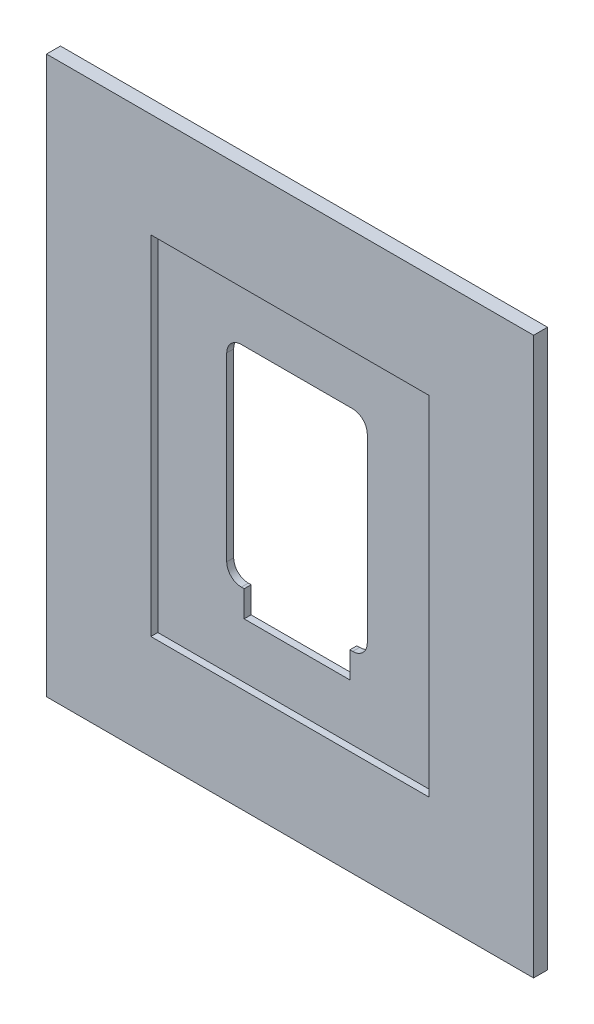
ISO-10303-21;
HEADER;
FILE_DESCRIPTION(('STEP AP214'),'2;1');
FILE_NAME('part.step','',(''),(''),'','','');
FILE_SCHEMA(('AUTOMOTIVE_DESIGN { 1 0 10303 214 1 1 1 1 }'));
ENDSEC;
DATA;
#1=APPLICATION_CONTEXT('core data for automotive mechanical design processes');
#2=APPLICATION_PROTOCOL_DEFINITION('international standard','automotive_design',2000,#1);
#3=PRODUCT_CONTEXT('',#1,'mechanical');
#4=PRODUCT('Part','Part','',(#3));
#5=PRODUCT_RELATED_PRODUCT_CATEGORY('part','',(#4));
#6=PRODUCT_DEFINITION_FORMATION('','',#4);
#7=PRODUCT_DEFINITION_CONTEXT('part definition',#1,'design');
#8=PRODUCT_DEFINITION('design','',#6,#7);
#9=PRODUCT_DEFINITION_SHAPE('','',#8);
#10=(LENGTH_UNIT() NAMED_UNIT(*) SI_UNIT(.MILLI.,.METRE.));
#11=(NAMED_UNIT(*) PLANE_ANGLE_UNIT() SI_UNIT($,.RADIAN.));
#12=(NAMED_UNIT(*) SI_UNIT($,.STERADIAN.) SOLID_ANGLE_UNIT());
#13=UNCERTAINTY_MEASURE_WITH_UNIT(LENGTH_MEASURE(1.E-05),#10,'distance_accuracy_value','');
#14=(GEOMETRIC_REPRESENTATION_CONTEXT(3) GLOBAL_UNCERTAINTY_ASSIGNED_CONTEXT((#13)) GLOBAL_UNIT_ASSIGNED_CONTEXT((#10,
#11,#12)) REPRESENTATION_CONTEXT('',''));
#15=CARTESIAN_POINT('',(0.,0.,0.));
#16=DIRECTION('',(0.,0.,1.));
#17=DIRECTION('',(1.,0.,0.));
#18=AXIS2_PLACEMENT_3D('',#15,#16,#17);
#19=CARTESIAN_POINT('',(70.,80.,2.));
#20=DIRECTION('',(-1.,0.,0.));
#21=DIRECTION('',(0.,-1.,0.));
#22=AXIS2_PLACEMENT_3D('',#19,#20,#21);
#23=PLANE('',#22);
#24=DIRECTION('',(0.,1.,0.));
#25=VECTOR('',#24,1.);
#26=CARTESIAN_POINT('',(70.,80.,0.));
#27=LINE('',#26,#25);
#28=CARTESIAN_POINT('',(70.,-80.,0.));
#29=VERTEX_POINT('',#28);
#30=CARTESIAN_POINT('',(70.,80.,0.));
#31=VERTEX_POINT('',#30);
#32=EDGE_CURVE('E305',#29,#31,#27,.T.);
#33=ORIENTED_EDGE('',*,*,#32,.T.);
#34=DIRECTION('',(0.,0.,-1.));
#35=VECTOR('',#34,1.);
#36=CARTESIAN_POINT('',(70.,80.,2.));
#37=LINE('',#36,#35);
#38=CARTESIAN_POINT('',(70.,80.,4.));
#39=VERTEX_POINT('',#38);
#40=EDGE_CURVE('E11',#39,#31,#37,.T.);
#41=ORIENTED_EDGE('',*,*,#40,.F.);
#42=DIRECTION('',(0.,1.,0.));
#43=VECTOR('',#42,1.);
#44=CARTESIAN_POINT('',(70.,-80.,4.));
#45=LINE('',#44,#43);
#46=CARTESIAN_POINT('',(70.,-80.,4.));
#47=VERTEX_POINT('',#46);
#48=EDGE_CURVE('E296',#47,#39,#45,.T.);
#49=ORIENTED_EDGE('',*,*,#48,.F.);
#50=DIRECTION('',(0.,0.,-1.));
#51=VECTOR('',#50,1.);
#52=CARTESIAN_POINT('',(70.,-80.,2.));
#53=LINE('',#52,#51);
#54=EDGE_CURVE('E314',#47,#29,#53,.T.);
#55=ORIENTED_EDGE('',*,*,#54,.T.);
#56=EDGE_LOOP('',(#33,#41,#49,#55));
#57=FACE_BOUND('',#56,.T.);
#58=ADVANCED_FACE('F33',(#57),#23,.F.);
#59=CARTESIAN_POINT('',(-70.,80.,2.));
#60=DIRECTION('',(0.,-1.,0.));
#61=DIRECTION('',(0.,0.,-1.));
#62=AXIS2_PLACEMENT_3D('',#59,#60,#61);
#63=PLANE('',#62);
#64=DIRECTION('',(-1.,0.,0.));
#65=VECTOR('',#64,1.);
#66=CARTESIAN_POINT('',(-70.,80.,0.));
#67=LINE('',#66,#65);
#68=CARTESIAN_POINT('',(-70.,80.,0.));
#69=VERTEX_POINT('',#68);
#70=EDGE_CURVE('E308',#31,#69,#67,.T.);
#71=ORIENTED_EDGE('',*,*,#70,.T.);
#72=DIRECTION('',(0.,0.,-1.));
#73=VECTOR('',#72,1.);
#74=CARTESIAN_POINT('',(-70.,80.,2.));
#75=LINE('',#74,#73);
#76=CARTESIAN_POINT('',(-70.,80.,4.));
#77=VERTEX_POINT('',#76);
#78=EDGE_CURVE('E40',#77,#69,#75,.T.);
#79=ORIENTED_EDGE('',*,*,#78,.F.);
#80=DIRECTION('',(-1.,0.,0.));
#81=VECTOR('',#80,1.);
#82=CARTESIAN_POINT('',(70.,80.,4.));
#83=LINE('',#82,#81);
#84=EDGE_CURVE('E299',#39,#77,#83,.T.);
#85=ORIENTED_EDGE('',*,*,#84,.F.);
#86=ORIENTED_EDGE('',*,*,#40,.T.);
#87=EDGE_LOOP('',(#71,#79,#85,#86));
#88=FACE_BOUND('',#87,.T.);
#89=ADVANCED_FACE('F336',(#88),#63,.F.);
#90=CARTESIAN_POINT('',(-70.,80.,2.));
#91=DIRECTION('',(1.,0.,0.));
#92=DIRECTION('',(0.,1.,0.));
#93=AXIS2_PLACEMENT_3D('',#90,#91,#92);
#94=PLANE('',#93);
#95=DIRECTION('',(0.,-1.,0.));
#96=VECTOR('',#95,1.);
#97=CARTESIAN_POINT('',(-70.,80.,0.));
#98=LINE('',#97,#96);
#99=CARTESIAN_POINT('',(-70.,-80.,0.));
#100=VERTEX_POINT('',#99);
#101=EDGE_CURVE('E310',#69,#100,#98,.T.);
#102=ORIENTED_EDGE('',*,*,#101,.T.);
#103=DIRECTION('',(0.,0.,-1.));
#104=VECTOR('',#103,1.);
#105=CARTESIAN_POINT('',(-70.,-80.,2.));
#106=LINE('',#105,#104);
#107=CARTESIAN_POINT('',(-70.,-80.,4.));
#108=VERTEX_POINT('',#107);
#109=EDGE_CURVE('E317',#108,#100,#106,.T.);
#110=ORIENTED_EDGE('',*,*,#109,.F.);
#111=DIRECTION('',(0.,-1.,0.));
#112=VECTOR('',#111,1.);
#113=CARTESIAN_POINT('',(-70.,80.,4.));
#114=LINE('',#113,#112);
#115=EDGE_CURVE('E302',#77,#108,#114,.T.);
#116=ORIENTED_EDGE('',*,*,#115,.F.);
#117=ORIENTED_EDGE('',*,*,#78,.T.);
#118=EDGE_LOOP('',(#102,#110,#116,#117));
#119=FACE_BOUND('',#118,.T.);
#120=ADVANCED_FACE('F323',(#119),#94,.F.);
#121=CARTESIAN_POINT('',(-70.,-80.,2.));
#122=DIRECTION('',(0.,1.,0.));
#123=DIRECTION('',(0.,0.,1.));
#124=AXIS2_PLACEMENT_3D('',#121,#122,#123);
#125=PLANE('',#124);
#126=DIRECTION('',(1.,0.,0.));
#127=VECTOR('',#126,1.);
#128=CARTESIAN_POINT('',(-70.,-80.,0.));
#129=LINE('',#128,#127);
#130=EDGE_CURVE('E312',#100,#29,#129,.T.);
#131=ORIENTED_EDGE('',*,*,#130,.T.);
#132=ORIENTED_EDGE('',*,*,#54,.F.);
#133=DIRECTION('',(1.,0.,0.));
#134=VECTOR('',#133,1.);
#135=CARTESIAN_POINT('',(-70.,-80.,4.));
#136=LINE('',#135,#134);
#137=EDGE_CURVE('E293',#108,#47,#136,.T.);
#138=ORIENTED_EDGE('',*,*,#137,.F.);
#139=ORIENTED_EDGE('',*,*,#109,.T.);
#140=EDGE_LOOP('',(#131,#132,#138,#139));
#141=FACE_BOUND('',#140,.T.);
#142=ADVANCED_FACE('F329',(#141),#125,.F.);
#143=CARTESIAN_POINT('',(0.,0.,0.));
#144=DIRECTION('',(0.,0.,1.));
#145=DIRECTION('',(1.,0.,0.));
#146=AXIS2_PLACEMENT_3D('',#143,#144,#145);
#147=PLANE('',#146);
#148=DIRECTION('',(0.,-1.,0.));
#149=VECTOR('',#148,1.);
#150=CARTESIAN_POINT('',(-15.2,0.,0.));
#151=LINE('',#150,#149);
#152=CARTESIAN_POINT('',(-15.2,-26.7,0.));
#153=VERTEX_POINT('',#152);
#154=CARTESIAN_POINT('',(-15.2,-34.2,0.));
#155=VERTEX_POINT('',#154);
#156=EDGE_CURVE('E185',#153,#155,#151,.T.);
#157=ORIENTED_EDGE('',*,*,#156,.T.);
#158=DIRECTION('',(1.,0.,0.));
#159=VECTOR('',#158,1.);
#160=CARTESIAN_POINT('',(0.,-34.2,0.));
#161=LINE('',#160,#159);
#162=CARTESIAN_POINT('',(15.2,-34.2,0.));
#163=VERTEX_POINT('',#162);
#164=EDGE_CURVE('E176',#155,#163,#161,.T.);
#165=ORIENTED_EDGE('',*,*,#164,.T.);
#166=DIRECTION('',(0.,-1.,0.));
#167=VECTOR('',#166,1.);
#168=CARTESIAN_POINT('',(15.2,0.,0.));
#169=LINE('',#168,#167);
#170=CARTESIAN_POINT('',(15.2,-26.7,0.));
#171=VERTEX_POINT('',#170);
#172=EDGE_CURVE('E167',#171,#163,#169,.T.);
#173=ORIENTED_EDGE('',*,*,#172,.F.);
#174=DIRECTION('',(-1.,0.,0.));
#175=VECTOR('',#174,1.);
#176=CARTESIAN_POINT('',(0.,-26.7,0.));
#177=LINE('',#176,#175);
#178=CARTESIAN_POINT('',(16.,-26.7,0.));
#179=VERTEX_POINT('',#178);
#180=EDGE_CURVE('E175',#179,#171,#177,.T.);
#181=ORIENTED_EDGE('',*,*,#180,.F.);
#182=CARTESIAN_POINT('',(16.,-22.5,0.));
#183=DIRECTION('',(0.,0.,1.));
#184=DIRECTION('',(1.,0.,0.));
#185=AXIS2_PLACEMENT_3D('',#182,#183,#184);
#186=CIRCLE('',#185,4.2);
#187=CARTESIAN_POINT('',(20.2,-22.5,0.));
#188=VERTEX_POINT('',#187);
#189=EDGE_CURVE('E197',#188,#179,#186,.F.);
#190=ORIENTED_EDGE('',*,*,#189,.F.);
#191=DIRECTION('',(0.,-1.,0.));
#192=VECTOR('',#191,1.);
#193=CARTESIAN_POINT('',(20.2,0.,0.));
#194=LINE('',#193,#192);
#195=CARTESIAN_POINT('',(20.2,29.5,0.));
#196=VERTEX_POINT('',#195);
#197=EDGE_CURVE('E199',#196,#188,#194,.T.);
#198=ORIENTED_EDGE('',*,*,#197,.F.);
#199=CARTESIAN_POINT('',(16.,29.5,0.));
#200=DIRECTION('',(0.,0.,1.));
#201=DIRECTION('',(1.,0.,0.));
#202=AXIS2_PLACEMENT_3D('',#199,#200,#201);
#203=CIRCLE('',#202,4.2);
#204=CARTESIAN_POINT('',(16.,33.7,0.));
#205=VERTEX_POINT('',#204);
#206=EDGE_CURVE('E201',#205,#196,#203,.F.);
#207=ORIENTED_EDGE('',*,*,#206,.F.);
#208=DIRECTION('',(-1.,0.,0.));
#209=VECTOR('',#208,1.);
#210=CARTESIAN_POINT('',(0.,33.7,0.));
#211=LINE('',#210,#209);
#212=CARTESIAN_POINT('',(-16.,33.7,0.));
#213=VERTEX_POINT('',#212);
#214=EDGE_CURVE('E203',#205,#213,#211,.T.);
#215=ORIENTED_EDGE('',*,*,#214,.T.);
#216=CARTESIAN_POINT('',(-16.,29.5,0.));
#217=DIRECTION('',(0.,0.,1.));
#218=DIRECTION('',(1.,0.,0.));
#219=AXIS2_PLACEMENT_3D('',#216,#217,#218);
#220=CIRCLE('',#219,4.20000000000001);
#221=CARTESIAN_POINT('',(-20.2,29.5,0.));
#222=VERTEX_POINT('',#221);
#223=EDGE_CURVE('E206',#222,#213,#220,.F.);
#224=ORIENTED_EDGE('',*,*,#223,.F.);
#225=DIRECTION('',(0.,1.,0.));
#226=VECTOR('',#225,1.);
#227=CARTESIAN_POINT('',(-20.2,0.,0.));
#228=LINE('',#227,#226);
#229=CARTESIAN_POINT('',(-20.2,-22.5,0.));
#230=VERTEX_POINT('',#229);
#231=EDGE_CURVE('E208',#230,#222,#228,.T.);
#232=ORIENTED_EDGE('',*,*,#231,.F.);
#233=CARTESIAN_POINT('',(-16.,-22.5,0.));
#234=DIRECTION('',(0.,0.,1.));
#235=DIRECTION('',(1.,0.,0.));
#236=AXIS2_PLACEMENT_3D('',#233,#234,#235);
#237=CIRCLE('',#236,4.2);
#238=CARTESIAN_POINT('',(-16.,-26.7,0.));
#239=VERTEX_POINT('',#238);
#240=EDGE_CURVE('E210',#239,#230,#237,.F.);
#241=ORIENTED_EDGE('',*,*,#240,.F.);
#242=DIRECTION('',(-1.,0.,0.));
#243=VECTOR('',#242,1.);
#244=CARTESIAN_POINT('',(0.,-26.7,0.));
#245=LINE('',#244,#243);
#246=EDGE_CURVE('E212',#153,#239,#245,.T.);
#247=ORIENTED_EDGE('',*,*,#246,.F.);
#248=EDGE_LOOP('',(#157,#165,#173,#181,#190,#198,#207,#215,#224,#232,#241,#247));
#249=FACE_BOUND('',#248,.T.);
#250=ORIENTED_EDGE('',*,*,#32,.F.);
#251=ORIENTED_EDGE('',*,*,#130,.F.);
#252=ORIENTED_EDGE('',*,*,#101,.F.);
#253=ORIENTED_EDGE('',*,*,#70,.F.);
#254=EDGE_LOOP('',(#250,#251,#252,#253));
#255=FACE_BOUND('',#254,.T.);
#256=ADVANCED_FACE('F187',(#249,#255),#147,.F.);
#257=CARTESIAN_POINT('',(0.,0.,4.));
#258=DIRECTION('',(0.,0.,1.));
#259=DIRECTION('',(1.,0.,0.));
#260=AXIS2_PLACEMENT_3D('',#257,#258,#259);
#261=PLANE('',#260);
#262=ORIENTED_EDGE('',*,*,#137,.T.);
#263=ORIENTED_EDGE('',*,*,#48,.T.);
#264=ORIENTED_EDGE('',*,*,#84,.T.);
#265=ORIENTED_EDGE('',*,*,#115,.T.);
#266=EDGE_LOOP('',(#262,#263,#264,#265));
#267=FACE_BOUND('',#266,.T.);
#268=DIRECTION('',(-1.,0.,0.));
#269=VECTOR('',#268,1.);
#270=CARTESIAN_POINT('',(-40.,50.,4.));
#271=LINE('',#270,#269);
#272=CARTESIAN_POINT('',(40.,50.,4.));
#273=VERTEX_POINT('',#272);
#274=CARTESIAN_POINT('',(-40.,50.,4.));
#275=VERTEX_POINT('',#274);
#276=EDGE_CURVE('E267',#273,#275,#271,.T.);
#277=ORIENTED_EDGE('',*,*,#276,.F.);
#278=DIRECTION('',(0.,1.,0.));
#279=VECTOR('',#278,1.);
#280=CARTESIAN_POINT('',(40.,50.,4.));
#281=LINE('',#280,#279);
#282=CARTESIAN_POINT('',(40.,-50.,4.));
#283=VERTEX_POINT('',#282);
#284=EDGE_CURVE('E265',#283,#273,#281,.T.);
#285=ORIENTED_EDGE('',*,*,#284,.F.);
#286=DIRECTION('',(1.,0.,0.));
#287=VECTOR('',#286,1.);
#288=CARTESIAN_POINT('',(-40.,-50.,4.));
#289=LINE('',#288,#287);
#290=CARTESIAN_POINT('',(-40.,-50.,4.));
#291=VERTEX_POINT('',#290);
#292=EDGE_CURVE('E273',#291,#283,#289,.T.);
#293=ORIENTED_EDGE('',*,*,#292,.F.);
#294=DIRECTION('',(0.,-1.,0.));
#295=VECTOR('',#294,1.);
#296=CARTESIAN_POINT('',(-40.,50.,4.));
#297=LINE('',#296,#295);
#298=EDGE_CURVE('E270',#275,#291,#297,.T.);
#299=ORIENTED_EDGE('',*,*,#298,.F.);
#300=EDGE_LOOP('',(#277,#285,#293,#299));
#301=FACE_BOUND('',#300,.T.);
#302=ADVANCED_FACE('F334',(#267,#301),#261,.T.);
#303=CARTESIAN_POINT('',(40.,50.,4.));
#304=DIRECTION('',(-1.,0.,0.));
#305=DIRECTION('',(0.,-1.,0.));
#306=AXIS2_PLACEMENT_3D('',#303,#304,#305);
#307=PLANE('',#306);
#308=DIRECTION('',(0.,1.,0.));
#309=VECTOR('',#308,1.);
#310=CARTESIAN_POINT('',(40.,50.,2.));
#311=LINE('',#310,#309);
#312=CARTESIAN_POINT('',(40.,-50.,2.));
#313=VERTEX_POINT('',#312);
#314=CARTESIAN_POINT('',(40.,50.,2.));
#315=VERTEX_POINT('',#314);
#316=EDGE_CURVE('E245',#313,#315,#311,.T.);
#317=ORIENTED_EDGE('',*,*,#316,.F.);
#318=DIRECTION('',(0.,0.,-1.));
#319=VECTOR('',#318,1.);
#320=CARTESIAN_POINT('',(40.,-50.,4.));
#321=LINE('',#320,#319);
#322=EDGE_CURVE('E275',#283,#313,#321,.T.);
#323=ORIENTED_EDGE('',*,*,#322,.F.);
#324=ORIENTED_EDGE('',*,*,#284,.T.);
#325=DIRECTION('',(0.,0.,-1.));
#326=VECTOR('',#325,1.);
#327=CARTESIAN_POINT('',(40.,50.,4.));
#328=LINE('',#327,#326);
#329=EDGE_CURVE('E290',#273,#315,#328,.T.);
#330=ORIENTED_EDGE('',*,*,#329,.T.);
#331=EDGE_LOOP('',(#317,#323,#324,#330));
#332=FACE_BOUND('',#331,.T.);
#333=ADVANCED_FACE('F355',(#332),#307,.T.);
#334=CARTESIAN_POINT('',(-40.,50.,4.));
#335=DIRECTION('',(0.,-1.,0.));
#336=DIRECTION('',(0.,0.,-1.));
#337=AXIS2_PLACEMENT_3D('',#334,#335,#336);
#338=PLANE('',#337);
#339=DIRECTION('',(-1.,0.,0.));
#340=VECTOR('',#339,1.);
#341=CARTESIAN_POINT('',(-40.,50.,2.));
#342=LINE('',#341,#340);
#343=CARTESIAN_POINT('',(-40.,50.,2.));
#344=VERTEX_POINT('',#343);
#345=EDGE_CURVE('E277',#315,#344,#342,.T.);
#346=ORIENTED_EDGE('',*,*,#345,.F.);
#347=ORIENTED_EDGE('',*,*,#329,.F.);
#348=ORIENTED_EDGE('',*,*,#276,.T.);
#349=DIRECTION('',(0.,0.,-1.));
#350=VECTOR('',#349,1.);
#351=CARTESIAN_POINT('',(-40.,50.,4.));
#352=LINE('',#351,#350);
#353=EDGE_CURVE('E287',#275,#344,#352,.T.);
#354=ORIENTED_EDGE('',*,*,#353,.T.);
#355=EDGE_LOOP('',(#346,#347,#348,#354));
#356=FACE_BOUND('',#355,.T.);
#357=ADVANCED_FACE('F358',(#356),#338,.T.);
#358=CARTESIAN_POINT('',(-40.,50.,4.));
#359=DIRECTION('',(1.,0.,0.));
#360=DIRECTION('',(0.,1.,0.));
#361=AXIS2_PLACEMENT_3D('',#358,#359,#360);
#362=PLANE('',#361);
#363=DIRECTION('',(0.,-1.,0.));
#364=VECTOR('',#363,1.);
#365=CARTESIAN_POINT('',(-40.,50.,2.));
#366=LINE('',#365,#364);
#367=CARTESIAN_POINT('',(-40.,-50.,2.));
#368=VERTEX_POINT('',#367);
#369=EDGE_CURVE('E279',#344,#368,#366,.T.);
#370=ORIENTED_EDGE('',*,*,#369,.F.);
#371=ORIENTED_EDGE('',*,*,#353,.F.);
#372=ORIENTED_EDGE('',*,*,#298,.T.);
#373=DIRECTION('',(0.,0.,-1.));
#374=VECTOR('',#373,1.);
#375=CARTESIAN_POINT('',(-40.,-50.,4.));
#376=LINE('',#375,#374);
#377=EDGE_CURVE('E284',#291,#368,#376,.T.);
#378=ORIENTED_EDGE('',*,*,#377,.T.);
#379=EDGE_LOOP('',(#370,#371,#372,#378));
#380=FACE_BOUND('',#379,.T.);
#381=ADVANCED_FACE('F362',(#380),#362,.T.);
#382=CARTESIAN_POINT('',(-40.,-50.,4.));
#383=DIRECTION('',(0.,1.,0.));
#384=DIRECTION('',(0.,0.,1.));
#385=AXIS2_PLACEMENT_3D('',#382,#383,#384);
#386=PLANE('',#385);
#387=DIRECTION('',(1.,0.,0.));
#388=VECTOR('',#387,1.);
#389=CARTESIAN_POINT('',(-40.,-50.,2.));
#390=LINE('',#389,#388);
#391=EDGE_CURVE('E268',#368,#313,#390,.T.);
#392=ORIENTED_EDGE('',*,*,#391,.F.);
#393=ORIENTED_EDGE('',*,*,#377,.F.);
#394=ORIENTED_EDGE('',*,*,#292,.T.);
#395=ORIENTED_EDGE('',*,*,#322,.T.);
#396=EDGE_LOOP('',(#392,#393,#394,#395));
#397=FACE_BOUND('',#396,.T.);
#398=ADVANCED_FACE('F351',(#397),#386,.T.);
#399=CARTESIAN_POINT('',(0.,0.,2.));
#400=DIRECTION('',(0.,0.,1.));
#401=DIRECTION('',(1.,0.,0.));
#402=AXIS2_PLACEMENT_3D('',#399,#400,#401);
#403=PLANE('',#402);
#404=DIRECTION('',(1.,0.,0.));
#405=VECTOR('',#404,1.);
#406=CARTESIAN_POINT('',(0.,-34.2,2.));
#407=LINE('',#406,#405);
#408=CARTESIAN_POINT('',(-15.2,-34.2,2.));
#409=VERTEX_POINT('',#408);
#410=CARTESIAN_POINT('',(15.2,-34.2,2.));
#411=VERTEX_POINT('',#410);
#412=EDGE_CURVE('E183',#409,#411,#407,.T.);
#413=ORIENTED_EDGE('',*,*,#412,.F.);
#414=DIRECTION('',(0.,-1.,0.));
#415=VECTOR('',#414,1.);
#416=CARTESIAN_POINT('',(-15.2,0.,2.));
#417=LINE('',#416,#415);
#418=CARTESIAN_POINT('',(-15.2,-26.7,2.));
#419=VERTEX_POINT('',#418);
#420=EDGE_CURVE('E191',#419,#409,#417,.T.);
#421=ORIENTED_EDGE('',*,*,#420,.F.);
#422=DIRECTION('',(-1.,0.,0.));
#423=VECTOR('',#422,1.);
#424=CARTESIAN_POINT('',(0.,-26.7,2.));
#425=LINE('',#424,#423);
#426=CARTESIAN_POINT('',(-16.,-26.7,2.));
#427=VERTEX_POINT('',#426);
#428=EDGE_CURVE('E47',#419,#427,#425,.T.);
#429=ORIENTED_EDGE('',*,*,#428,.T.);
#430=CARTESIAN_POINT('',(-16.,-22.5,2.));
#431=DIRECTION('',(0.,0.,1.));
#432=DIRECTION('',(1.,0.,0.));
#433=AXIS2_PLACEMENT_3D('',#430,#431,#432);
#434=CIRCLE('',#433,4.2);
#435=CARTESIAN_POINT('',(-20.2,-22.5,2.));
#436=VERTEX_POINT('',#435);
#437=EDGE_CURVE('E239',#427,#436,#434,.F.);
#438=ORIENTED_EDGE('',*,*,#437,.T.);
#439=DIRECTION('',(0.,1.,0.));
#440=VECTOR('',#439,1.);
#441=CARTESIAN_POINT('',(-20.2,0.,2.));
#442=LINE('',#441,#440);
#443=CARTESIAN_POINT('',(-20.2,29.5,2.));
#444=VERTEX_POINT('',#443);
#445=EDGE_CURVE('E236',#436,#444,#442,.T.);
#446=ORIENTED_EDGE('',*,*,#445,.T.);
#447=CARTESIAN_POINT('',(-16.,29.5,2.));
#448=DIRECTION('',(0.,0.,1.));
#449=DIRECTION('',(1.,0.,0.));
#450=AXIS2_PLACEMENT_3D('',#447,#448,#449);
#451=CIRCLE('',#450,4.20000000000001);
#452=CARTESIAN_POINT('',(-16.,33.7,2.));
#453=VERTEX_POINT('',#452);
#454=EDGE_CURVE('E233',#444,#453,#451,.F.);
#455=ORIENTED_EDGE('',*,*,#454,.T.);
#456=DIRECTION('',(-1.,0.,0.));
#457=VECTOR('',#456,1.);
#458=CARTESIAN_POINT('',(0.,33.7,2.));
#459=LINE('',#458,#457);
#460=CARTESIAN_POINT('',(16.,33.7,2.));
#461=VERTEX_POINT('',#460);
#462=EDGE_CURVE('E230',#461,#453,#459,.T.);
#463=ORIENTED_EDGE('',*,*,#462,.F.);
#464=CARTESIAN_POINT('',(16.,29.5,2.));
#465=DIRECTION('',(0.,0.,1.));
#466=DIRECTION('',(1.,0.,0.));
#467=AXIS2_PLACEMENT_3D('',#464,#465,#466);
#468=CIRCLE('',#467,4.2);
#469=CARTESIAN_POINT('',(20.2,29.5,2.));
#470=VERTEX_POINT('',#469);
#471=EDGE_CURVE('E227',#461,#470,#468,.F.);
#472=ORIENTED_EDGE('',*,*,#471,.T.);
#473=DIRECTION('',(0.,-1.,0.));
#474=VECTOR('',#473,1.);
#475=CARTESIAN_POINT('',(20.2,0.,2.));
#476=LINE('',#475,#474);
#477=CARTESIAN_POINT('',(20.2,-22.5,2.));
#478=VERTEX_POINT('',#477);
#479=EDGE_CURVE('E224',#470,#478,#476,.T.);
#480=ORIENTED_EDGE('',*,*,#479,.T.);
#481=CARTESIAN_POINT('',(16.,-22.5,2.));
#482=DIRECTION('',(0.,0.,1.));
#483=DIRECTION('',(1.,0.,0.));
#484=AXIS2_PLACEMENT_3D('',#481,#482,#483);
#485=CIRCLE('',#484,4.2);
#486=CARTESIAN_POINT('',(16.,-26.7,2.));
#487=VERTEX_POINT('',#486);
#488=EDGE_CURVE('E221',#478,#487,#485,.F.);
#489=ORIENTED_EDGE('',*,*,#488,.T.);
#490=DIRECTION('',(-1.,0.,0.));
#491=VECTOR('',#490,1.);
#492=CARTESIAN_POINT('',(0.,-26.7,2.));
#493=LINE('',#492,#491);
#494=CARTESIAN_POINT('',(15.2,-26.7,2.));
#495=VERTEX_POINT('',#494);
#496=EDGE_CURVE('E218',#487,#495,#493,.T.);
#497=ORIENTED_EDGE('',*,*,#496,.T.);
#498=DIRECTION('',(0.,-1.,0.));
#499=VECTOR('',#498,1.);
#500=CARTESIAN_POINT('',(15.2,0.,2.));
#501=LINE('',#500,#499);
#502=EDGE_CURVE('E216',#495,#411,#501,.T.);
#503=ORIENTED_EDGE('',*,*,#502,.T.);
#504=EDGE_LOOP('',(#413,#421,#429,#438,#446,#455,#463,#472,#480,#489,#497,#503));
#505=FACE_BOUND('',#504,.T.);
#506=ORIENTED_EDGE('',*,*,#316,.T.);
#507=ORIENTED_EDGE('',*,*,#345,.T.);
#508=ORIENTED_EDGE('',*,*,#369,.T.);
#509=ORIENTED_EDGE('',*,*,#391,.T.);
#510=EDGE_LOOP('',(#506,#507,#508,#509));
#511=FACE_BOUND('',#510,.T.);
#512=ADVANCED_FACE('F348',(#505,#511),#403,.T.);
#513=CARTESIAN_POINT('',(0.,-34.2,0.));
#514=DIRECTION('',(0.,-1.,0.));
#515=DIRECTION('',(0.,0.,-1.));
#516=AXIS2_PLACEMENT_3D('',#513,#514,#515);
#517=PLANE('',#516);
#518=ORIENTED_EDGE('',*,*,#412,.T.);
#519=DIRECTION('',(0.,0.,1.));
#520=VECTOR('',#519,1.);
#521=CARTESIAN_POINT('',(15.2,-34.2,0.));
#522=LINE('',#521,#520);
#523=EDGE_CURVE('E170',#163,#411,#522,.T.);
#524=ORIENTED_EDGE('',*,*,#523,.F.);
#525=ORIENTED_EDGE('',*,*,#164,.F.);
#526=DIRECTION('',(0.,0.,1.));
#527=VECTOR('',#526,1.);
#528=CARTESIAN_POINT('',(-15.2,-34.2,0.));
#529=LINE('',#528,#527);
#530=EDGE_CURVE('E243',#155,#409,#529,.T.);
#531=ORIENTED_EDGE('',*,*,#530,.T.);
#532=EDGE_LOOP('',(#518,#524,#525,#531));
#533=FACE_BOUND('',#532,.T.);
#534=ADVANCED_FACE('F180',(#533),#517,.F.);
#535=CARTESIAN_POINT('',(-15.2,0.,0.));
#536=DIRECTION('',(-1.,0.,0.));
#537=DIRECTION('',(0.,-1.,0.));
#538=AXIS2_PLACEMENT_3D('',#535,#536,#537);
#539=PLANE('',#538);
#540=ORIENTED_EDGE('',*,*,#420,.T.);
#541=ORIENTED_EDGE('',*,*,#530,.F.);
#542=ORIENTED_EDGE('',*,*,#156,.F.);
#543=DIRECTION('',(0.,0.,1.));
#544=VECTOR('',#543,1.);
#545=CARTESIAN_POINT('',(-15.2,-26.7,0.));
#546=LINE('',#545,#544);
#547=EDGE_CURVE('E246',#153,#419,#546,.T.);
#548=ORIENTED_EDGE('',*,*,#547,.T.);
#549=EDGE_LOOP('',(#540,#541,#542,#548));
#550=FACE_BOUND('',#549,.T.);
#551=ADVANCED_FACE('F372',(#550),#539,.F.);
#552=CARTESIAN_POINT('',(0.,-26.7,0.));
#553=DIRECTION('',(0.,1.,0.));
#554=DIRECTION('',(0.,0.,1.));
#555=AXIS2_PLACEMENT_3D('',#552,#553,#554);
#556=PLANE('',#555);
#557=ORIENTED_EDGE('',*,*,#428,.F.);
#558=ORIENTED_EDGE('',*,*,#547,.F.);
#559=ORIENTED_EDGE('',*,*,#246,.T.);
#560=DIRECTION('',(0.,0.,1.));
#561=VECTOR('',#560,1.);
#562=CARTESIAN_POINT('',(-16.,-26.7,0.));
#563=LINE('',#562,#561);
#564=EDGE_CURVE('E248',#239,#427,#563,.T.);
#565=ORIENTED_EDGE('',*,*,#564,.T.);
#566=EDGE_LOOP('',(#557,#558,#559,#565));
#567=FACE_BOUND('',#566,.T.);
#568=ADVANCED_FACE('F406',(#567),#556,.T.);
#569=CARTESIAN_POINT('',(-16.,-22.5,0.));
#570=DIRECTION('',(0.,0.,1.));
#571=DIRECTION('',(1.,0.,0.));
#572=AXIS2_PLACEMENT_3D('',#569,#570,#571);
#573=CYLINDRICAL_SURFACE('',#572,4.2);
#574=ORIENTED_EDGE('',*,*,#437,.F.);
#575=ORIENTED_EDGE('',*,*,#564,.F.);
#576=ORIENTED_EDGE('',*,*,#240,.T.);
#577=DIRECTION('',(0.,0.,1.));
#578=VECTOR('',#577,1.);
#579=CARTESIAN_POINT('',(-20.2,-22.5,0.));
#580=LINE('',#579,#578);
#581=EDGE_CURVE('E250',#230,#436,#580,.T.);
#582=ORIENTED_EDGE('',*,*,#581,.T.);
#583=EDGE_LOOP('',(#574,#575,#576,#582));
#584=FACE_BOUND('',#583,.T.);
#585=ADVANCED_FACE('F402',(#584),#573,.F.);
#586=CARTESIAN_POINT('',(-20.2,0.,0.));
#587=DIRECTION('',(1.,0.,0.));
#588=DIRECTION('',(0.,1.,0.));
#589=AXIS2_PLACEMENT_3D('',#586,#587,#588);
#590=PLANE('',#589);
#591=ORIENTED_EDGE('',*,*,#445,.F.);
#592=ORIENTED_EDGE('',*,*,#581,.F.);
#593=ORIENTED_EDGE('',*,*,#231,.T.);
#594=DIRECTION('',(0.,0.,1.));
#595=VECTOR('',#594,1.);
#596=CARTESIAN_POINT('',(-20.2,29.5,0.));
#597=LINE('',#596,#595);
#598=EDGE_CURVE('E252',#222,#444,#597,.T.);
#599=ORIENTED_EDGE('',*,*,#598,.T.);
#600=EDGE_LOOP('',(#591,#592,#593,#599));
#601=FACE_BOUND('',#600,.T.);
#602=ADVANCED_FACE('F398',(#601),#590,.T.);
#603=CARTESIAN_POINT('',(-16.,29.5,0.));
#604=DIRECTION('',(0.,0.,1.));
#605=DIRECTION('',(1.,0.,0.));
#606=AXIS2_PLACEMENT_3D('',#603,#604,#605);
#607=CYLINDRICAL_SURFACE('',#606,4.20000000000001);
#608=ORIENTED_EDGE('',*,*,#454,.F.);
#609=ORIENTED_EDGE('',*,*,#598,.F.);
#610=ORIENTED_EDGE('',*,*,#223,.T.);
#611=DIRECTION('',(0.,0.,1.));
#612=VECTOR('',#611,1.);
#613=CARTESIAN_POINT('',(-16.,33.7,0.));
#614=LINE('',#613,#612);
#615=EDGE_CURVE('E254',#213,#453,#614,.T.);
#616=ORIENTED_EDGE('',*,*,#615,.T.);
#617=EDGE_LOOP('',(#608,#609,#610,#616));
#618=FACE_BOUND('',#617,.T.);
#619=ADVANCED_FACE('F394',(#618),#607,.F.);
#620=CARTESIAN_POINT('',(0.,33.7,0.));
#621=DIRECTION('',(0.,1.,0.));
#622=DIRECTION('',(0.,0.,1.));
#623=AXIS2_PLACEMENT_3D('',#620,#621,#622);
#624=PLANE('',#623);
#625=ORIENTED_EDGE('',*,*,#462,.T.);
#626=ORIENTED_EDGE('',*,*,#615,.F.);
#627=ORIENTED_EDGE('',*,*,#214,.F.);
#628=DIRECTION('',(0.,0.,1.));
#629=VECTOR('',#628,1.);
#630=CARTESIAN_POINT('',(16.,33.7,0.));
#631=LINE('',#630,#629);
#632=EDGE_CURVE('E256',#205,#461,#631,.T.);
#633=ORIENTED_EDGE('',*,*,#632,.T.);
#634=EDGE_LOOP('',(#625,#626,#627,#633));
#635=FACE_BOUND('',#634,.T.);
#636=ADVANCED_FACE('F390',(#635),#624,.F.);
#637=CARTESIAN_POINT('',(16.,29.5,0.));
#638=DIRECTION('',(0.,0.,1.));
#639=DIRECTION('',(1.,0.,0.));
#640=AXIS2_PLACEMENT_3D('',#637,#638,#639);
#641=CYLINDRICAL_SURFACE('',#640,4.2);
#642=ORIENTED_EDGE('',*,*,#471,.F.);
#643=ORIENTED_EDGE('',*,*,#632,.F.);
#644=ORIENTED_EDGE('',*,*,#206,.T.);
#645=DIRECTION('',(0.,0.,1.));
#646=VECTOR('',#645,1.);
#647=CARTESIAN_POINT('',(20.2,29.5,0.));
#648=LINE('',#647,#646);
#649=EDGE_CURVE('E258',#196,#470,#648,.T.);
#650=ORIENTED_EDGE('',*,*,#649,.T.);
#651=EDGE_LOOP('',(#642,#643,#644,#650));
#652=FACE_BOUND('',#651,.T.);
#653=ADVANCED_FACE('F386',(#652),#641,.F.);
#654=CARTESIAN_POINT('',(20.2,0.,0.));
#655=DIRECTION('',(-1.,0.,0.));
#656=DIRECTION('',(0.,-1.,0.));
#657=AXIS2_PLACEMENT_3D('',#654,#655,#656);
#658=PLANE('',#657);
#659=ORIENTED_EDGE('',*,*,#479,.F.);
#660=ORIENTED_EDGE('',*,*,#649,.F.);
#661=ORIENTED_EDGE('',*,*,#197,.T.);
#662=DIRECTION('',(0.,0.,1.));
#663=VECTOR('',#662,1.);
#664=CARTESIAN_POINT('',(20.2,-22.5,0.));
#665=LINE('',#664,#663);
#666=EDGE_CURVE('E260',#188,#478,#665,.T.);
#667=ORIENTED_EDGE('',*,*,#666,.T.);
#668=EDGE_LOOP('',(#659,#660,#661,#667));
#669=FACE_BOUND('',#668,.T.);
#670=ADVANCED_FACE('F382',(#669),#658,.T.);
#671=CARTESIAN_POINT('',(16.,-22.5,0.));
#672=DIRECTION('',(0.,0.,1.));
#673=DIRECTION('',(1.,0.,0.));
#674=AXIS2_PLACEMENT_3D('',#671,#672,#673);
#675=CYLINDRICAL_SURFACE('',#674,4.2);
#676=ORIENTED_EDGE('',*,*,#488,.F.);
#677=ORIENTED_EDGE('',*,*,#666,.F.);
#678=ORIENTED_EDGE('',*,*,#189,.T.);
#679=DIRECTION('',(0.,0.,1.));
#680=VECTOR('',#679,1.);
#681=CARTESIAN_POINT('',(16.,-26.7,0.));
#682=LINE('',#681,#680);
#683=EDGE_CURVE('E262',#179,#487,#682,.T.);
#684=ORIENTED_EDGE('',*,*,#683,.T.);
#685=EDGE_LOOP('',(#676,#677,#678,#684));
#686=FACE_BOUND('',#685,.T.);
#687=ADVANCED_FACE('F378',(#686),#675,.F.);
#688=CARTESIAN_POINT('',(0.,-26.7,0.));
#689=DIRECTION('',(0.,1.,0.));
#690=DIRECTION('',(0.,0.,1.));
#691=AXIS2_PLACEMENT_3D('',#688,#689,#690);
#692=PLANE('',#691);
#693=ORIENTED_EDGE('',*,*,#496,.F.);
#694=ORIENTED_EDGE('',*,*,#683,.F.);
#695=ORIENTED_EDGE('',*,*,#180,.T.);
#696=DIRECTION('',(0.,0.,1.));
#697=VECTOR('',#696,1.);
#698=CARTESIAN_POINT('',(15.2,-26.7,0.));
#699=LINE('',#698,#697);
#700=EDGE_CURVE('E55',#171,#495,#699,.T.);
#701=ORIENTED_EDGE('',*,*,#700,.T.);
#702=EDGE_LOOP('',(#693,#694,#695,#701));
#703=FACE_BOUND('',#702,.T.);
#704=ADVANCED_FACE('F375',(#703),#692,.T.);
#705=CARTESIAN_POINT('',(15.2,0.,0.));
#706=DIRECTION('',(-1.,0.,0.));
#707=DIRECTION('',(0.,0.,1.));
#708=AXIS2_PLACEMENT_3D('',#705,#706,#707);
#709=PLANE('',#708);
#710=ORIENTED_EDGE('',*,*,#502,.F.);
#711=ORIENTED_EDGE('',*,*,#700,.F.);
#712=ORIENTED_EDGE('',*,*,#172,.T.);
#713=ORIENTED_EDGE('',*,*,#523,.T.);
#714=EDGE_LOOP('',(#710,#711,#712,#713));
#715=FACE_BOUND('',#714,.T.);
#716=ADVANCED_FACE('F169',(#715),#709,.T.);
#717=CLOSED_SHELL('',(#58,#89,#120,#142,#256,#302,#333,#357,#381,#398,#512,#534,#551,#568,#585,
#602,#619,#636,#653,#670,#687,#704,#716));
#718=MANIFOLD_SOLID_BREP('B2',#717);
#719=ADVANCED_BREP_SHAPE_REPRESENTATION('',(#18,#718),#14);
#720=SHAPE_DEFINITION_REPRESENTATION(#9,#719);
ENDSEC;
END-ISO-10303-21;
